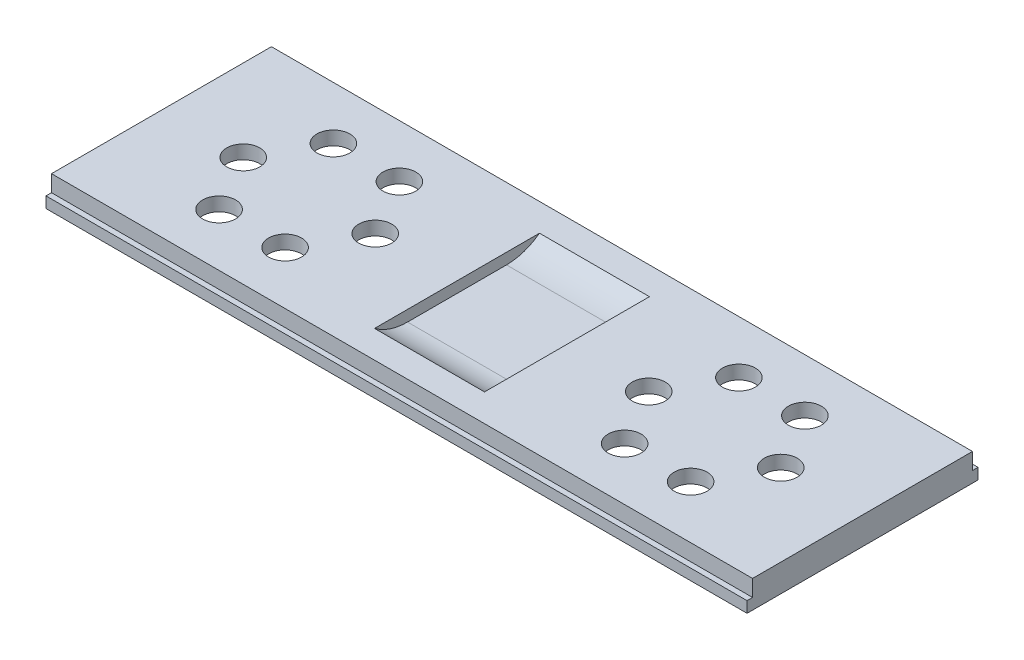
ISO-10303-21;
HEADER;
FILE_DESCRIPTION(('STEP AP214'),'2;1');
FILE_NAME('part.step','',(''),(''),'','','');
FILE_SCHEMA(('AUTOMOTIVE_DESIGN { 1 0 10303 214 1 1 1 1 }'));
ENDSEC;
DATA;
#1=APPLICATION_CONTEXT('core data for automotive mechanical design processes');
#2=APPLICATION_PROTOCOL_DEFINITION('international standard','automotive_design',2000,#1);
#3=PRODUCT_CONTEXT('',#1,'mechanical');
#4=PRODUCT('Part','Part','',(#3));
#5=PRODUCT_RELATED_PRODUCT_CATEGORY('part','',(#4));
#6=PRODUCT_DEFINITION_FORMATION('','',#4);
#7=PRODUCT_DEFINITION_CONTEXT('part definition',#1,'design');
#8=PRODUCT_DEFINITION('design','',#6,#7);
#9=PRODUCT_DEFINITION_SHAPE('','',#8);
#10=(LENGTH_UNIT() NAMED_UNIT(*) SI_UNIT(.MILLI.,.METRE.));
#11=(NAMED_UNIT(*) PLANE_ANGLE_UNIT() SI_UNIT($,.RADIAN.));
#12=(NAMED_UNIT(*) SI_UNIT($,.STERADIAN.) SOLID_ANGLE_UNIT());
#13=UNCERTAINTY_MEASURE_WITH_UNIT(LENGTH_MEASURE(1.E-05),#10,'distance_accuracy_value','');
#14=(GEOMETRIC_REPRESENTATION_CONTEXT(3) GLOBAL_UNCERTAINTY_ASSIGNED_CONTEXT((#13)) GLOBAL_UNIT_ASSIGNED_CONTEXT((#10,
#11,#12)) REPRESENTATION_CONTEXT('',''));
#15=CARTESIAN_POINT('',(0.,0.,0.));
#16=DIRECTION('',(0.,0.,1.));
#17=DIRECTION('',(1.,0.,0.));
#18=AXIS2_PLACEMENT_3D('',#15,#16,#17);
#19=CARTESIAN_POINT('',(-51.2673238301791,5.,23.60614063367));
#20=DIRECTION('',(0.,0.,-1.));
#21=DIRECTION('',(-1.,0.,0.));
#22=AXIS2_PLACEMENT_3D('',#19,#20,#21);
#23=PLANE('',#22);
#24=DIRECTION('',(1.,0.,0.));
#25=VECTOR('',#24,1.);
#26=CARTESIAN_POINT('',(76.2326761698209,2.,23.60614063367));
#27=LINE('',#26,#25);
#28=CARTESIAN_POINT('',(-51.2673238301791,2.,23.60614063367));
#29=VERTEX_POINT('',#28);
#30=CARTESIAN_POINT('',(76.2326761698209,2.,23.60614063367));
#31=VERTEX_POINT('',#30);
#32=EDGE_CURVE('E284',#29,#31,#27,.T.);
#33=ORIENTED_EDGE('',*,*,#32,.F.);
#34=DIRECTION('',(0.,-1.,0.));
#35=VECTOR('',#34,1.);
#36=CARTESIAN_POINT('',(-51.2673238301791,5.,23.60614063367));
#37=LINE('',#36,#35);
#38=CARTESIAN_POINT('',(-51.2673238301791,0.,23.60614063367));
#39=VERTEX_POINT('',#38);
#40=EDGE_CURVE('E314',#29,#39,#37,.T.);
#41=ORIENTED_EDGE('',*,*,#40,.T.);
#42=DIRECTION('',(1.,0.,0.));
#43=VECTOR('',#42,1.);
#44=CARTESIAN_POINT('',(-51.2673238301791,0.,23.60614063367));
#45=LINE('',#44,#43);
#46=CARTESIAN_POINT('',(76.2326761698209,0.,23.60614063367));
#47=VERTEX_POINT('',#46);
#48=EDGE_CURVE('E301',#39,#47,#45,.T.);
#49=ORIENTED_EDGE('',*,*,#48,.T.);
#50=DIRECTION('',(0.,-1.,0.));
#51=VECTOR('',#50,1.);
#52=CARTESIAN_POINT('',(76.2326761698209,5.,23.60614063367));
#53=LINE('',#52,#51);
#54=EDGE_CURVE('E312',#31,#47,#53,.T.);
#55=ORIENTED_EDGE('',*,*,#54,.F.);
#56=EDGE_LOOP('',(#33,#41,#49,#55));
#57=FACE_BOUND('',#56,.T.);
#58=ADVANCED_FACE('F34',(#57),#23,.F.);
#59=CARTESIAN_POINT('',(-51.2673238301791,5.,-18.39385936633));
#60=DIRECTION('',(1.,0.,0.));
#61=DIRECTION('',(0.,0.,-1.));
#62=AXIS2_PLACEMENT_3D('',#59,#60,#61);
#63=PLANE('',#62);
#64=DIRECTION('',(0.,0.,1.));
#65=VECTOR('',#64,1.);
#66=CARTESIAN_POINT('',(-51.2673238301791,5.,-18.39385936633));
#67=LINE('',#66,#65);
#68=CARTESIAN_POINT('',(-51.2673238301791,5.,-17.3938593663299));
#69=VERTEX_POINT('',#68);
#70=CARTESIAN_POINT('',(-51.2673238301791,5.,22.6061406336701));
#71=VERTEX_POINT('',#70);
#72=EDGE_CURVE('E291',#69,#71,#67,.T.);
#73=ORIENTED_EDGE('',*,*,#72,.F.);
#74=DIRECTION('',(0.,1.,0.));
#75=VECTOR('',#74,1.);
#76=CARTESIAN_POINT('',(-51.2673238301791,2.,-17.3938593663299));
#77=LINE('',#76,#75);
#78=CARTESIAN_POINT('',(-51.2673238301791,2.,-17.3938593663299));
#79=VERTEX_POINT('',#78);
#80=EDGE_CURVE('E268',#79,#69,#77,.T.);
#81=ORIENTED_EDGE('',*,*,#80,.F.);
#82=DIRECTION('',(0.,0.,1.));
#83=VECTOR('',#82,1.);
#84=CARTESIAN_POINT('',(-51.2673238301791,2.,-18.39385936633));
#85=LINE('',#84,#83);
#86=CARTESIAN_POINT('',(-51.2673238301791,2.,-18.39385936633));
#87=VERTEX_POINT('',#86);
#88=EDGE_CURVE('E263',#87,#79,#85,.T.);
#89=ORIENTED_EDGE('',*,*,#88,.F.);
#90=DIRECTION('',(0.,-1.,0.));
#91=VECTOR('',#90,1.);
#92=CARTESIAN_POINT('',(-51.2673238301791,5.,-18.39385936633));
#93=LINE('',#92,#91);
#94=CARTESIAN_POINT('',(-51.2673238301791,0.,-18.39385936633));
#95=VERTEX_POINT('',#94);
#96=EDGE_CURVE('E298',#87,#95,#93,.T.);
#97=ORIENTED_EDGE('',*,*,#96,.T.);
#98=DIRECTION('',(0.,0.,1.));
#99=VECTOR('',#98,1.);
#100=CARTESIAN_POINT('',(-51.2673238301791,0.,-18.39385936633));
#101=LINE('',#100,#99);
#102=EDGE_CURVE('E274',#95,#39,#101,.T.);
#103=ORIENTED_EDGE('',*,*,#102,.T.);
#104=ORIENTED_EDGE('',*,*,#40,.F.);
#105=DIRECTION('',(0.,0.,1.));
#106=VECTOR('',#105,1.);
#107=CARTESIAN_POINT('',(-51.2673238301791,2.,23.60614063367));
#108=LINE('',#107,#106);
#109=CARTESIAN_POINT('',(-51.2673238301791,2.,22.6061406336701));
#110=VERTEX_POINT('',#109);
#111=EDGE_CURVE('E282',#110,#29,#108,.T.);
#112=ORIENTED_EDGE('',*,*,#111,.F.);
#113=DIRECTION('',(0.,1.,0.));
#114=VECTOR('',#113,1.);
#115=CARTESIAN_POINT('',(-51.2673238301791,2.,22.6061406336701));
#116=LINE('',#115,#114);
#117=EDGE_CURVE('E270',#110,#71,#116,.T.);
#118=ORIENTED_EDGE('',*,*,#117,.T.);
#119=EDGE_LOOP('',(#73,#81,#89,#97,#103,#104,#112,#118));
#120=FACE_BOUND('',#119,.T.);
#121=ADVANCED_FACE('F354',(#120),#63,.F.);
#122=CARTESIAN_POINT('',(76.2326761698209,5.,-18.39385936633));
#123=DIRECTION('',(-1.,0.,0.));
#124=DIRECTION('',(0.,0.,1.));
#125=AXIS2_PLACEMENT_3D('',#122,#123,#124);
#126=PLANE('',#125);
#127=DIRECTION('',(0.,0.,-1.));
#128=VECTOR('',#127,1.);
#129=CARTESIAN_POINT('',(76.2326761698209,2.,-18.39385936633));
#130=LINE('',#129,#128);
#131=CARTESIAN_POINT('',(76.2326761698209,2.,-17.39385936633));
#132=VERTEX_POINT('',#131);
#133=CARTESIAN_POINT('',(76.2326761698209,2.,-18.39385936633));
#134=VERTEX_POINT('',#133);
#135=EDGE_CURVE('E258',#132,#134,#130,.T.);
#136=ORIENTED_EDGE('',*,*,#135,.F.);
#137=DIRECTION('',(0.,1.,0.));
#138=VECTOR('',#137,1.);
#139=CARTESIAN_POINT('',(76.2326761698209,2.,-17.39385936633));
#140=LINE('',#139,#138);
#141=CARTESIAN_POINT('',(76.2326761698209,5.,-17.39385936633));
#142=VERTEX_POINT('',#141);
#143=EDGE_CURVE('E271',#132,#142,#140,.T.);
#144=ORIENTED_EDGE('',*,*,#143,.T.);
#145=DIRECTION('',(0.,0.,-1.));
#146=VECTOR('',#145,1.);
#147=CARTESIAN_POINT('',(76.2326761698209,5.,-18.39385936633));
#148=LINE('',#147,#146);
#149=CARTESIAN_POINT('',(76.2326761698209,5.,22.60614063367));
#150=VERTEX_POINT('',#149);
#151=EDGE_CURVE('E294',#150,#142,#148,.T.);
#152=ORIENTED_EDGE('',*,*,#151,.F.);
#153=DIRECTION('',(0.,1.,0.));
#154=VECTOR('',#153,1.);
#155=CARTESIAN_POINT('',(76.2326761698209,2.,22.60614063367));
#156=LINE('',#155,#154);
#157=CARTESIAN_POINT('',(76.2326761698209,2.,22.60614063367));
#158=VERTEX_POINT('',#157);
#159=EDGE_CURVE('E286',#158,#150,#156,.T.);
#160=ORIENTED_EDGE('',*,*,#159,.F.);
#161=DIRECTION('',(0.,0.,-1.));
#162=VECTOR('',#161,1.);
#163=CARTESIAN_POINT('',(76.2326761698209,2.,23.60614063367));
#164=LINE('',#163,#162);
#165=EDGE_CURVE('E276',#31,#158,#164,.T.);
#166=ORIENTED_EDGE('',*,*,#165,.F.);
#167=ORIENTED_EDGE('',*,*,#54,.T.);
#168=DIRECTION('',(0.,0.,-1.));
#169=VECTOR('',#168,1.);
#170=CARTESIAN_POINT('',(76.2326761698209,0.,-18.39385936633));
#171=LINE('',#170,#169);
#172=CARTESIAN_POINT('',(76.2326761698209,0.,-18.39385936633));
#173=VERTEX_POINT('',#172);
#174=EDGE_CURVE('E304',#47,#173,#171,.T.);
#175=ORIENTED_EDGE('',*,*,#174,.T.);
#176=DIRECTION('',(0.,-1.,0.));
#177=VECTOR('',#176,1.);
#178=CARTESIAN_POINT('',(76.2326761698209,5.,-18.39385936633));
#179=LINE('',#178,#177);
#180=EDGE_CURVE('E310',#134,#173,#179,.T.);
#181=ORIENTED_EDGE('',*,*,#180,.F.);
#182=EDGE_LOOP('',(#136,#144,#152,#160,#166,#167,#175,#181));
#183=FACE_BOUND('',#182,.T.);
#184=ADVANCED_FACE('F360',(#183),#126,.F.);
#185=CARTESIAN_POINT('',(-51.2673238301791,5.,-18.39385936633));
#186=DIRECTION('',(0.,0.,1.));
#187=DIRECTION('',(1.,0.,0.));
#188=AXIS2_PLACEMENT_3D('',#185,#186,#187);
#189=PLANE('',#188);
#190=ORIENTED_EDGE('',*,*,#96,.F.);
#191=DIRECTION('',(-1.,0.,0.));
#192=VECTOR('',#191,1.);
#193=CARTESIAN_POINT('',(76.2326761698209,2.,-18.39385936633));
#194=LINE('',#193,#192);
#195=EDGE_CURVE('E260',#134,#87,#194,.T.);
#196=ORIENTED_EDGE('',*,*,#195,.F.);
#197=ORIENTED_EDGE('',*,*,#180,.T.);
#198=DIRECTION('',(-1.,0.,0.));
#199=VECTOR('',#198,1.);
#200=CARTESIAN_POINT('',(-51.2673238301791,0.,-18.39385936633));
#201=LINE('',#200,#199);
#202=EDGE_CURVE('E295',#173,#95,#201,.T.);
#203=ORIENTED_EDGE('',*,*,#202,.T.);
#204=EDGE_LOOP('',(#190,#196,#197,#203));
#205=FACE_BOUND('',#204,.T.);
#206=ADVANCED_FACE('F366',(#205),#189,.F.);
#207=CARTESIAN_POINT('',(0.,5.,0.));
#208=DIRECTION('',(0.,1.,0.));
#209=DIRECTION('',(0.,0.,1.));
#210=AXIS2_PLACEMENT_3D('',#207,#208,#209);
#211=PLANE('',#210);
#212=CARTESIAN_POINT('',(43.3576761698208,5.,12.9984454790833));
#213=DIRECTION('',(0.,1.,0.));
#214=DIRECTION('',(0.,0.,1.));
#215=AXIS2_PLACEMENT_3D('',#212,#213,#214);
#216=CIRCLE('',#215,3.00000000000001);
#217=CARTESIAN_POINT('',(43.3576761698208,5.,15.9984454790833));
#218=VERTEX_POINT('',#217);
#219=EDGE_CURVE('E481',#218,#218,#216,.T.);
#220=ORIENTED_EDGE('',*,*,#219,.F.);
#221=EDGE_LOOP('',(#220));
#222=FACE_BOUND('',#221,.T.);
#223=CARTESIAN_POINT('',(55.3576761698209,5.,12.9984454790833));
#224=DIRECTION('',(0.,1.,0.));
#225=DIRECTION('',(0.,0.,1.));
#226=AXIS2_PLACEMENT_3D('',#223,#224,#225);
#227=CIRCLE('',#226,3.00000000000001);
#228=CARTESIAN_POINT('',(55.3576761698209,5.,15.9984454790833));
#229=VERTEX_POINT('',#228);
#230=EDGE_CURVE('E511',#229,#229,#227,.T.);
#231=ORIENTED_EDGE('',*,*,#230,.F.);
#232=EDGE_LOOP('',(#231));
#233=FACE_BOUND('',#232,.T.);
#234=CARTESIAN_POINT('',(-18.392323830179,5.,-7.78616421174316));
#235=DIRECTION('',(0.,1.,0.));
#236=DIRECTION('',(0.,0.,1.));
#237=AXIS2_PLACEMENT_3D('',#234,#235,#236);
#238=CIRCLE('',#237,3.);
#239=CARTESIAN_POINT('',(-18.392323830179,5.,-4.78616421174316));
#240=VERTEX_POINT('',#239);
#241=EDGE_CURVE('E505',#240,#240,#238,.T.);
#242=ORIENTED_EDGE('',*,*,#241,.F.);
#243=EDGE_LOOP('',(#242));
#244=FACE_BOUND('',#243,.T.);
#245=CARTESIAN_POINT('',(-30.392323830179,5.,-7.78616421174328));
#246=DIRECTION('',(0.,1.,0.));
#247=DIRECTION('',(0.,0.,1.));
#248=AXIS2_PLACEMENT_3D('',#245,#246,#247);
#249=CIRCLE('',#248,3.);
#250=CARTESIAN_POINT('',(-30.392323830179,5.,-4.78616421174328));
#251=VERTEX_POINT('',#250);
#252=EDGE_CURVE('E499',#251,#251,#249,.T.);
#253=ORIENTED_EDGE('',*,*,#252,.F.);
#254=EDGE_LOOP('',(#253));
#255=FACE_BOUND('',#254,.T.);
#256=CARTESIAN_POINT('',(-36.3923238301791,5.,2.60614063366996));
#257=DIRECTION('',(0.,1.,0.));
#258=DIRECTION('',(0.,0.,1.));
#259=AXIS2_PLACEMENT_3D('',#256,#257,#258);
#260=CIRCLE('',#259,3.);
#261=CARTESIAN_POINT('',(-36.3923238301791,5.,5.60614063366996));
#262=VERTEX_POINT('',#261);
#263=EDGE_CURVE('E498',#262,#262,#260,.T.);
#264=ORIENTED_EDGE('',*,*,#263,.F.);
#265=EDGE_LOOP('',(#264));
#266=FACE_BOUND('',#265,.T.);
#267=CARTESIAN_POINT('',(-30.3923238301792,5.,12.9984454790833));
#268=DIRECTION('',(0.,1.,0.));
#269=DIRECTION('',(0.,0.,1.));
#270=AXIS2_PLACEMENT_3D('',#267,#268,#269);
#271=CIRCLE('',#270,3.);
#272=CARTESIAN_POINT('',(-30.3923238301792,5.,15.9984454790833));
#273=VERTEX_POINT('',#272);
#274=EDGE_CURVE('E534',#273,#273,#271,.T.);
#275=ORIENTED_EDGE('',*,*,#274,.F.);
#276=EDGE_LOOP('',(#275));
#277=FACE_BOUND('',#276,.T.);
#278=CARTESIAN_POINT('',(-18.3923238301791,5.,12.9984454790833));
#279=DIRECTION('',(0.,1.,0.));
#280=DIRECTION('',(0.,0.,1.));
#281=AXIS2_PLACEMENT_3D('',#278,#279,#280);
#282=CIRCLE('',#281,3.);
#283=CARTESIAN_POINT('',(-18.3923238301791,5.,15.9984454790833));
#284=VERTEX_POINT('',#283);
#285=EDGE_CURVE('E528',#284,#284,#282,.T.);
#286=ORIENTED_EDGE('',*,*,#285,.F.);
#287=EDGE_LOOP('',(#286));
#288=FACE_BOUND('',#287,.T.);
#289=CARTESIAN_POINT('',(61.3576761698209,5.,2.60614063367005));
#290=DIRECTION('',(0.,1.,0.));
#291=DIRECTION('',(0.,0.,1.));
#292=AXIS2_PLACEMENT_3D('',#289,#290,#291);
#293=CIRCLE('',#292,3.00000000000001);
#294=CARTESIAN_POINT('',(61.3576761698209,5.,5.60614063367005));
#295=VERTEX_POINT('',#294);
#296=EDGE_CURVE('E522',#295,#295,#293,.T.);
#297=ORIENTED_EDGE('',*,*,#296,.F.);
#298=EDGE_LOOP('',(#297));
#299=FACE_BOUND('',#298,.T.);
#300=CARTESIAN_POINT('',(37.3576761698209,5.,2.60614063366996));
#301=DIRECTION('',(0.,1.,0.));
#302=DIRECTION('',(0.,0.,1.));
#303=AXIS2_PLACEMENT_3D('',#300,#301,#302);
#304=CIRCLE('',#303,3.00000000000001);
#305=CARTESIAN_POINT('',(37.3576761698209,5.,5.60614063366997));
#306=VERTEX_POINT('',#305);
#307=EDGE_CURVE('E477',#306,#306,#304,.T.);
#308=ORIENTED_EDGE('',*,*,#307,.F.);
#309=EDGE_LOOP('',(#308));
#310=FACE_BOUND('',#309,.T.);
#311=CARTESIAN_POINT('',(43.357676169821,5.,-7.78616421174326));
#312=DIRECTION('',(0.,1.,0.));
#313=DIRECTION('',(0.,0.,1.));
#314=AXIS2_PLACEMENT_3D('',#311,#312,#313);
#315=CIRCLE('',#314,3.00000000000001);
#316=CARTESIAN_POINT('',(43.357676169821,5.,-4.78616421174325));
#317=VERTEX_POINT('',#316);
#318=EDGE_CURVE('E484',#317,#317,#315,.T.);
#319=ORIENTED_EDGE('',*,*,#318,.F.);
#320=EDGE_LOOP('',(#319));
#321=FACE_BOUND('',#320,.T.);
#322=CARTESIAN_POINT('',(55.357676169821,5.,-7.78616421174314));
#323=DIRECTION('',(0.,1.,0.));
#324=DIRECTION('',(0.,0.,1.));
#325=AXIS2_PLACEMENT_3D('',#322,#323,#324);
#326=CIRCLE('',#325,3.00000000000001);
#327=CARTESIAN_POINT('',(55.357676169821,5.,-4.78616421174313));
#328=VERTEX_POINT('',#327);
#329=EDGE_CURVE('E492',#328,#328,#326,.T.);
#330=ORIENTED_EDGE('',*,*,#329,.F.);
#331=EDGE_LOOP('',(#330));
#332=FACE_BOUND('',#331,.T.);
#333=CARTESIAN_POINT('',(-12.3923238301791,5.,2.60614063367005));
#334=DIRECTION('',(0.,1.,0.));
#335=DIRECTION('',(0.,0.,1.));
#336=AXIS2_PLACEMENT_3D('',#333,#334,#335);
#337=CIRCLE('',#336,3.);
#338=CARTESIAN_POINT('',(-12.3923238301791,5.,5.60614063367005));
#339=VERTEX_POINT('',#338);
#340=EDGE_CURVE('E206',#339,#339,#337,.T.);
#341=ORIENTED_EDGE('',*,*,#340,.F.);
#342=EDGE_LOOP('',(#341));
#343=FACE_BOUND('',#342,.T.);
#344=DIRECTION('',(0.,0.,-1.));
#345=VECTOR('',#344,1.);
#346=CARTESIAN_POINT('',(22.4826761698209,5.,-12.39385936633));
#347=LINE('',#346,#345);
#348=CARTESIAN_POINT('',(22.4826761698209,5.,17.60614063367));
#349=VERTEX_POINT('',#348);
#350=CARTESIAN_POINT('',(22.4826761698209,5.,-12.39385936633));
#351=VERTEX_POINT('',#350);
#352=EDGE_CURVE('E244',#349,#351,#347,.T.);
#353=ORIENTED_EDGE('',*,*,#352,.F.);
#354=DIRECTION('',(1.,0.,0.));
#355=VECTOR('',#354,1.);
#356=CARTESIAN_POINT('',(2.48267616982091,5.,17.60614063367));
#357=LINE('',#356,#355);
#358=CARTESIAN_POINT('',(2.48267616982091,5.,17.60614063367));
#359=VERTEX_POINT('',#358);
#360=EDGE_CURVE('E248',#359,#349,#357,.T.);
#361=ORIENTED_EDGE('',*,*,#360,.F.);
#362=DIRECTION('',(0.,0.,1.));
#363=VECTOR('',#362,1.);
#364=CARTESIAN_POINT('',(2.4826761698209,5.,-12.39385936633));
#365=LINE('',#364,#363);
#366=CARTESIAN_POINT('',(2.4826761698209,5.,-12.39385936633));
#367=VERTEX_POINT('',#366);
#368=EDGE_CURVE('E254',#367,#359,#365,.T.);
#369=ORIENTED_EDGE('',*,*,#368,.F.);
#370=DIRECTION('',(-1.,0.,0.));
#371=VECTOR('',#370,1.);
#372=CARTESIAN_POINT('',(2.4826761698209,5.,-12.39385936633));
#373=LINE('',#372,#371);
#374=EDGE_CURVE('E252',#351,#367,#373,.T.);
#375=ORIENTED_EDGE('',*,*,#374,.F.);
#376=EDGE_LOOP('',(#353,#361,#369,#375));
#377=FACE_BOUND('',#376,.T.);
#378=DIRECTION('',(1.,0.,0.));
#379=VECTOR('',#378,1.);
#380=CARTESIAN_POINT('',(76.2326761698209,5.,-17.39385936633));
#381=LINE('',#380,#379);
#382=EDGE_CURVE('E261',#69,#142,#381,.T.);
#383=ORIENTED_EDGE('',*,*,#382,.F.);
#384=ORIENTED_EDGE('',*,*,#72,.T.);
#385=DIRECTION('',(-1.,0.,0.));
#386=VECTOR('',#385,1.);
#387=CARTESIAN_POINT('',(76.2326761698209,5.,22.60614063367));
#388=LINE('',#387,#386);
#389=EDGE_CURVE('E250',#150,#71,#388,.T.);
#390=ORIENTED_EDGE('',*,*,#389,.F.);
#391=ORIENTED_EDGE('',*,*,#151,.T.);
#392=EDGE_LOOP('',(#383,#384,#390,#391));
#393=FACE_BOUND('',#392,.T.);
#394=ADVANCED_FACE('F333',(#222,#233,#244,#255,#266,#277,#288,#299,#310,#321,#332,#343,#377,
#393),#211,.T.);
#395=CARTESIAN_POINT('',(0.,0.,0.));
#396=DIRECTION('',(0.,1.,0.));
#397=DIRECTION('',(0.,0.,1.));
#398=AXIS2_PLACEMENT_3D('',#395,#396,#397);
#399=PLANE('',#398);
#400=DIRECTION('',(-1.,0.,0.));
#401=VECTOR('',#400,1.);
#402=CARTESIAN_POINT('',(0.,0.,20.1061406336701));
#403=LINE('',#402,#401);
#404=CARTESIAN_POINT('',(73.7326761698209,0.,20.10614063367));
#405=VERTEX_POINT('',#404);
#406=CARTESIAN_POINT('',(-48.7673238301791,0.,20.1061406336701));
#407=VERTEX_POINT('',#406);
#408=EDGE_CURVE('E242',#405,#407,#403,.T.);
#409=ORIENTED_EDGE('',*,*,#408,.F.);
#410=DIRECTION('',(0.,0.,-1.));
#411=VECTOR('',#410,1.);
#412=CARTESIAN_POINT('',(73.7326761698209,0.,-18.39385936633));
#413=LINE('',#412,#411);
#414=CARTESIAN_POINT('',(73.7326761698209,0.,-14.89385936633));
#415=VERTEX_POINT('',#414);
#416=EDGE_CURVE('E198',#405,#415,#413,.T.);
#417=ORIENTED_EDGE('',*,*,#416,.T.);
#418=DIRECTION('',(-1.,0.,0.));
#419=VECTOR('',#418,1.);
#420=CARTESIAN_POINT('',(76.2326761698209,0.,-14.89385936633));
#421=LINE('',#420,#419);
#422=CARTESIAN_POINT('',(-48.7673238301791,0.,-14.8938593663299));
#423=VERTEX_POINT('',#422);
#424=EDGE_CURVE('E201',#415,#423,#421,.T.);
#425=ORIENTED_EDGE('',*,*,#424,.T.);
#426=DIRECTION('',(0.,0.,1.));
#427=VECTOR('',#426,1.);
#428=CARTESIAN_POINT('',(-48.7673238301791,0.,-18.39385936633));
#429=LINE('',#428,#427);
#430=EDGE_CURVE('E189',#423,#407,#429,.T.);
#431=ORIENTED_EDGE('',*,*,#430,.T.);
#432=EDGE_LOOP('',(#409,#417,#425,#431));
#433=FACE_BOUND('',#432,.T.);
#434=ORIENTED_EDGE('',*,*,#102,.F.);
#435=ORIENTED_EDGE('',*,*,#202,.F.);
#436=ORIENTED_EDGE('',*,*,#174,.F.);
#437=ORIENTED_EDGE('',*,*,#48,.F.);
#438=EDGE_LOOP('',(#434,#435,#436,#437));
#439=FACE_BOUND('',#438,.T.);
#440=ADVANCED_FACE('F371',(#433,#439),#399,.F.);
#441=CARTESIAN_POINT('',(76.2326761698209,2.,22.60614063367));
#442=DIRECTION('',(0.,0.,-1.));
#443=DIRECTION('',(-1.,0.,0.));
#444=AXIS2_PLACEMENT_3D('',#441,#442,#443);
#445=PLANE('',#444);
#446=ORIENTED_EDGE('',*,*,#389,.T.);
#447=ORIENTED_EDGE('',*,*,#117,.F.);
#448=DIRECTION('',(-1.,0.,0.));
#449=VECTOR('',#448,1.);
#450=CARTESIAN_POINT('',(76.2326761698209,2.,22.60614063367));
#451=LINE('',#450,#449);
#452=EDGE_CURVE('E279',#158,#110,#451,.T.);
#453=ORIENTED_EDGE('',*,*,#452,.F.);
#454=ORIENTED_EDGE('',*,*,#159,.T.);
#455=EDGE_LOOP('',(#446,#447,#453,#454));
#456=FACE_BOUND('',#455,.T.);
#457=ADVANCED_FACE('F374',(#456),#445,.F.);
#458=CARTESIAN_POINT('',(0.,2.,0.));
#459=DIRECTION('',(0.,1.,0.));
#460=DIRECTION('',(0.,0.,1.));
#461=AXIS2_PLACEMENT_3D('',#458,#459,#460);
#462=PLANE('',#461);
#463=ORIENTED_EDGE('',*,*,#165,.T.);
#464=ORIENTED_EDGE('',*,*,#452,.T.);
#465=ORIENTED_EDGE('',*,*,#111,.T.);
#466=ORIENTED_EDGE('',*,*,#32,.T.);
#467=EDGE_LOOP('',(#463,#464,#465,#466));
#468=FACE_BOUND('',#467,.T.);
#469=ADVANCED_FACE('F381',(#468),#462,.T.);
#470=CARTESIAN_POINT('',(76.2326761698209,2.,-17.39385936633));
#471=DIRECTION('',(0.,0.,1.));
#472=DIRECTION('',(1.,0.,0.));
#473=AXIS2_PLACEMENT_3D('',#470,#471,#472);
#474=PLANE('',#473);
#475=ORIENTED_EDGE('',*,*,#382,.T.);
#476=ORIENTED_EDGE('',*,*,#143,.F.);
#477=DIRECTION('',(1.,0.,0.));
#478=VECTOR('',#477,1.);
#479=CARTESIAN_POINT('',(76.2326761698209,2.,-17.39385936633));
#480=LINE('',#479,#478);
#481=EDGE_CURVE('E265',#79,#132,#480,.T.);
#482=ORIENTED_EDGE('',*,*,#481,.F.);
#483=ORIENTED_EDGE('',*,*,#80,.T.);
#484=EDGE_LOOP('',(#475,#476,#482,#483));
#485=FACE_BOUND('',#484,.T.);
#486=ADVANCED_FACE('F385',(#485),#474,.F.);
#487=CARTESIAN_POINT('',(0.,2.,0.));
#488=DIRECTION('',(0.,-1.,0.));
#489=DIRECTION('',(0.,0.,-1.));
#490=AXIS2_PLACEMENT_3D('',#487,#488,#489);
#491=PLANE('',#490);
#492=ORIENTED_EDGE('',*,*,#135,.T.);
#493=ORIENTED_EDGE('',*,*,#195,.T.);
#494=ORIENTED_EDGE('',*,*,#88,.T.);
#495=ORIENTED_EDGE('',*,*,#481,.T.);
#496=EDGE_LOOP('',(#492,#493,#494,#495));
#497=FACE_BOUND('',#496,.T.);
#498=ADVANCED_FACE('F389',(#497),#491,.F.);
#499=CARTESIAN_POINT('',(22.4826761698209,3.,-12.39385936633));
#500=DIRECTION('',(1.,0.,0.));
#501=DIRECTION('',(0.,0.,-1.));
#502=AXIS2_PLACEMENT_3D('',#499,#500,#501);
#503=PLANE('',#502);
#504=ORIENTED_EDGE('',*,*,#352,.T.);
#505=CARTESIAN_POINT('',(22.4826761698209,13.,-6.39385936632995));
#506=DIRECTION('',(1.,0.,0.));
#507=DIRECTION('',(0.,0.,-1.));
#508=AXIS2_PLACEMENT_3D('',#505,#506,#507);
#509=CIRCLE('',#508,10.);
#510=CARTESIAN_POINT('',(22.4826761698209,3.,-6.39385936632995));
#511=VERTEX_POINT('',#510);
#512=EDGE_CURVE('E11',#351,#511,#509,.F.);
#513=ORIENTED_EDGE('',*,*,#512,.T.);
#514=DIRECTION('',(0.,0.,-1.));
#515=VECTOR('',#514,1.);
#516=CARTESIAN_POINT('',(22.4826761698209,3.,-12.39385936633));
#517=LINE('',#516,#515);
#518=CARTESIAN_POINT('',(22.4826761698209,3.,11.60614063367));
#519=VERTEX_POINT('',#518);
#520=EDGE_CURVE('E245',#519,#511,#517,.T.);
#521=ORIENTED_EDGE('',*,*,#520,.F.);
#522=CARTESIAN_POINT('',(22.4826761698209,13.,11.60614063367));
#523=DIRECTION('',(1.,0.,0.));
#524=DIRECTION('',(0.,0.,-1.));
#525=AXIS2_PLACEMENT_3D('',#522,#523,#524);
#526=CIRCLE('',#525,10.);
#527=EDGE_CURVE('E319',#519,#349,#526,.F.);
#528=ORIENTED_EDGE('',*,*,#527,.T.);
#529=EDGE_LOOP('',(#504,#513,#521,#528));
#530=FACE_BOUND('',#529,.T.);
#531=ADVANCED_FACE('F339',(#530),#503,.F.);
#532=CARTESIAN_POINT('',(2.4826761698209,3.,-12.39385936633));
#533=DIRECTION('',(-1.,0.,0.));
#534=DIRECTION('',(0.,0.,1.));
#535=AXIS2_PLACEMENT_3D('',#532,#533,#534);
#536=PLANE('',#535);
#537=DIRECTION('',(0.,0.,1.));
#538=VECTOR('',#537,1.);
#539=CARTESIAN_POINT('',(2.4826761698209,3.,-12.39385936633));
#540=LINE('',#539,#538);
#541=CARTESIAN_POINT('',(2.4826761698209,3.,-6.39385936632995));
#542=VERTEX_POINT('',#541);
#543=CARTESIAN_POINT('',(2.48267616982091,3.,11.60614063367));
#544=VERTEX_POINT('',#543);
#545=EDGE_CURVE('E247',#542,#544,#540,.T.);
#546=ORIENTED_EDGE('',*,*,#545,.F.);
#547=CARTESIAN_POINT('',(2.4826761698209,13.,-6.39385936632995));
#548=DIRECTION('',(-1.,0.,0.));
#549=DIRECTION('',(0.,0.,1.));
#550=AXIS2_PLACEMENT_3D('',#547,#548,#549);
#551=CIRCLE('',#550,10.);
#552=EDGE_CURVE('E42',#542,#367,#551,.F.);
#553=ORIENTED_EDGE('',*,*,#552,.T.);
#554=ORIENTED_EDGE('',*,*,#368,.T.);
#555=CARTESIAN_POINT('',(2.48267616982091,13.,11.60614063367));
#556=DIRECTION('',(-1.,0.,0.));
#557=DIRECTION('',(0.,0.,1.));
#558=AXIS2_PLACEMENT_3D('',#555,#556,#557);
#559=CIRCLE('',#558,10.);
#560=EDGE_CURVE('E321',#359,#544,#559,.F.);
#561=ORIENTED_EDGE('',*,*,#560,.T.);
#562=EDGE_LOOP('',(#546,#553,#554,#561));
#563=FACE_BOUND('',#562,.T.);
#564=ADVANCED_FACE('F328',(#563),#536,.F.);
#565=CARTESIAN_POINT('',(0.,3.,0.));
#566=DIRECTION('',(0.,1.,0.));
#567=DIRECTION('',(0.,0.,1.));
#568=AXIS2_PLACEMENT_3D('',#565,#566,#567);
#569=PLANE('',#568);
#570=ORIENTED_EDGE('',*,*,#520,.T.);
#571=DIRECTION('',(-1.,0.,0.));
#572=VECTOR('',#571,1.);
#573=CARTESIAN_POINT('',(2.4826761698209,3.,-6.39385936632995));
#574=LINE('',#573,#572);
#575=EDGE_CURVE('E324',#511,#542,#574,.T.);
#576=ORIENTED_EDGE('',*,*,#575,.T.);
#577=ORIENTED_EDGE('',*,*,#545,.T.);
#578=DIRECTION('',(1.,0.,0.));
#579=VECTOR('',#578,1.);
#580=CARTESIAN_POINT('',(22.4826761698209,3.,11.60614063367));
#581=LINE('',#580,#579);
#582=EDGE_CURVE('E316',#544,#519,#581,.T.);
#583=ORIENTED_EDGE('',*,*,#582,.T.);
#584=EDGE_LOOP('',(#570,#576,#577,#583));
#585=FACE_BOUND('',#584,.T.);
#586=ADVANCED_FACE('F337',(#585),#569,.T.);
#587=CARTESIAN_POINT('',(76.2326761698209,2.,-14.89385936633));
#588=DIRECTION('',(0.,0.,1.));
#589=DIRECTION('',(1.,0.,0.));
#590=AXIS2_PLACEMENT_3D('',#587,#588,#589);
#591=PLANE('',#590);
#592=DIRECTION('',(0.,1.,0.));
#593=VECTOR('',#592,1.);
#594=CARTESIAN_POINT('',(24.9826761698209,3.,-14.89385936633));
#595=LINE('',#594,#593);
#596=CARTESIAN_POINT('',(24.9826761698209,0.5,-14.89385936633));
#597=VERTEX_POINT('',#596);
#598=CARTESIAN_POINT('',(24.9826761698209,2.5,-14.89385936633));
#599=VERTEX_POINT('',#598);
#600=EDGE_CURVE('E224',#597,#599,#595,.T.);
#601=ORIENTED_EDGE('',*,*,#600,.F.);
#602=DIRECTION('',(-1.,0.,0.));
#603=VECTOR('',#602,1.);
#604=CARTESIAN_POINT('',(0.,0.5,-14.89385936633));
#605=LINE('',#604,#603);
#606=CARTESIAN_POINT('',(-0.0173238301790973,0.5,-14.89385936633));
#607=VERTEX_POINT('',#606);
#608=EDGE_CURVE('E229',#597,#607,#605,.T.);
#609=ORIENTED_EDGE('',*,*,#608,.T.);
#610=DIRECTION('',(0.,1.,0.));
#611=VECTOR('',#610,1.);
#612=CARTESIAN_POINT('',(-0.0173238301790974,3.,-14.89385936633));
#613=LINE('',#612,#611);
#614=CARTESIAN_POINT('',(-0.0173238301790973,2.5,-14.8938593663299));
#615=VERTEX_POINT('',#614);
#616=EDGE_CURVE('E175',#607,#615,#613,.T.);
#617=ORIENTED_EDGE('',*,*,#616,.T.);
#618=DIRECTION('',(1.,0.,0.));
#619=VECTOR('',#618,1.);
#620=CARTESIAN_POINT('',(0.,2.5,-14.8938593663299));
#621=LINE('',#620,#619);
#622=CARTESIAN_POINT('',(-48.7673238301791,2.5,-14.8938593663299));
#623=VERTEX_POINT('',#622);
#624=EDGE_CURVE('E169',#623,#615,#621,.T.);
#625=ORIENTED_EDGE('',*,*,#624,.F.);
#626=DIRECTION('',(0.,1.,0.));
#627=VECTOR('',#626,1.);
#628=CARTESIAN_POINT('',(-48.7673238301791,2.,-14.8938593663299));
#629=LINE('',#628,#627);
#630=EDGE_CURVE('E172',#423,#623,#629,.T.);
#631=ORIENTED_EDGE('',*,*,#630,.F.);
#632=ORIENTED_EDGE('',*,*,#424,.F.);
#633=DIRECTION('',(0.,1.,0.));
#634=VECTOR('',#633,1.);
#635=CARTESIAN_POINT('',(73.7326761698209,5.,-14.89385936633));
#636=LINE('',#635,#634);
#637=CARTESIAN_POINT('',(73.7326761698209,2.5,-14.89385936633));
#638=VERTEX_POINT('',#637);
#639=EDGE_CURVE('E191',#415,#638,#636,.T.);
#640=ORIENTED_EDGE('',*,*,#639,.T.);
#641=EDGE_CURVE('E180',#599,#638,#621,.T.);
#642=ORIENTED_EDGE('',*,*,#641,.F.);
#643=EDGE_LOOP('',(#601,#609,#617,#625,#631,#632,#640,#642));
#644=FACE_BOUND('',#643,.T.);
#645=ADVANCED_FACE('F171',(#644),#591,.T.);
#646=CARTESIAN_POINT('',(76.2326761698209,2.,20.10614063367));
#647=DIRECTION('',(0.,0.,-1.));
#648=DIRECTION('',(-1.,0.,0.));
#649=AXIS2_PLACEMENT_3D('',#646,#647,#648);
#650=PLANE('',#649);
#651=DIRECTION('',(0.,1.,0.));
#652=VECTOR('',#651,1.);
#653=CARTESIAN_POINT('',(-0.0173238301790928,3.,20.10614063367));
#654=LINE('',#653,#652);
#655=CARTESIAN_POINT('',(-0.0173238301790928,0.5,20.10614063367));
#656=VERTEX_POINT('',#655);
#657=CARTESIAN_POINT('',(-0.0173238301790928,2.5,20.10614063367));
#658=VERTEX_POINT('',#657);
#659=EDGE_CURVE('E232',#656,#658,#654,.T.);
#660=ORIENTED_EDGE('',*,*,#659,.F.);
#661=DIRECTION('',(1.,0.,0.));
#662=VECTOR('',#661,1.);
#663=CARTESIAN_POINT('',(0.,0.5,20.10614063367));
#664=LINE('',#663,#662);
#665=CARTESIAN_POINT('',(24.9826761698209,0.5,20.10614063367));
#666=VERTEX_POINT('',#665);
#667=EDGE_CURVE('E226',#656,#666,#664,.T.);
#668=ORIENTED_EDGE('',*,*,#667,.T.);
#669=DIRECTION('',(0.,1.,0.));
#670=VECTOR('',#669,1.);
#671=CARTESIAN_POINT('',(24.9826761698209,3.,20.10614063367));
#672=LINE('',#671,#670);
#673=CARTESIAN_POINT('',(24.9826761698209,2.5,20.10614063367));
#674=VERTEX_POINT('',#673);
#675=EDGE_CURVE('E230',#666,#674,#672,.T.);
#676=ORIENTED_EDGE('',*,*,#675,.T.);
#677=DIRECTION('',(-1.,0.,0.));
#678=VECTOR('',#677,1.);
#679=CARTESIAN_POINT('',(0.,2.5,20.1061406336701));
#680=LINE('',#679,#678);
#681=CARTESIAN_POINT('',(73.7326761698209,2.5,20.10614063367));
#682=VERTEX_POINT('',#681);
#683=EDGE_CURVE('E223',#682,#674,#680,.T.);
#684=ORIENTED_EDGE('',*,*,#683,.F.);
#685=DIRECTION('',(0.,1.,0.));
#686=VECTOR('',#685,1.);
#687=CARTESIAN_POINT('',(73.7326761698209,2.,20.10614063367));
#688=LINE('',#687,#686);
#689=EDGE_CURVE('E210',#405,#682,#688,.T.);
#690=ORIENTED_EDGE('',*,*,#689,.F.);
#691=ORIENTED_EDGE('',*,*,#408,.T.);
#692=DIRECTION('',(0.,1.,0.));
#693=VECTOR('',#692,1.);
#694=CARTESIAN_POINT('',(-48.7673238301791,5.,20.1061406336701));
#695=LINE('',#694,#693);
#696=CARTESIAN_POINT('',(-48.7673238301791,2.5,20.1061406336701));
#697=VERTEX_POINT('',#696);
#698=EDGE_CURVE('E181',#407,#697,#695,.T.);
#699=ORIENTED_EDGE('',*,*,#698,.T.);
#700=EDGE_CURVE('E196',#658,#697,#680,.T.);
#701=ORIENTED_EDGE('',*,*,#700,.F.);
#702=EDGE_LOOP('',(#660,#668,#676,#684,#690,#691,#699,#701));
#703=FACE_BOUND('',#702,.T.);
#704=ADVANCED_FACE('F410',(#703),#650,.T.);
#705=CARTESIAN_POINT('',(0.,2.5,0.));
#706=DIRECTION('',(0.,1.,0.));
#707=DIRECTION('',(0.,0.,1.));
#708=AXIS2_PLACEMENT_3D('',#705,#706,#707);
#709=PLANE('',#708);
#710=CARTESIAN_POINT('',(-18.392323830179,2.5,-7.78616421174316));
#711=DIRECTION('',(0.,1.,0.));
#712=DIRECTION('',(0.,0.,1.));
#713=AXIS2_PLACEMENT_3D('',#710,#711,#712);
#714=CIRCLE('',#713,3.);
#715=CARTESIAN_POINT('',(-18.392323830179,2.5,-4.78616421174316));
#716=VERTEX_POINT('',#715);
#717=EDGE_CURVE('E502',#716,#716,#714,.T.);
#718=ORIENTED_EDGE('',*,*,#717,.T.);
#719=EDGE_LOOP('',(#718));
#720=FACE_BOUND('',#719,.T.);
#721=CARTESIAN_POINT('',(-30.392323830179,2.5,-7.78616421174328));
#722=DIRECTION('',(0.,1.,0.));
#723=DIRECTION('',(0.,0.,1.));
#724=AXIS2_PLACEMENT_3D('',#721,#722,#723);
#725=CIRCLE('',#724,3.);
#726=CARTESIAN_POINT('',(-30.392323830179,2.5,-4.78616421174328));
#727=VERTEX_POINT('',#726);
#728=EDGE_CURVE('E495',#727,#727,#725,.T.);
#729=ORIENTED_EDGE('',*,*,#728,.T.);
#730=EDGE_LOOP('',(#729));
#731=FACE_BOUND('',#730,.T.);
#732=CARTESIAN_POINT('',(-36.3923238301791,2.5,2.60614063366996));
#733=DIRECTION('',(0.,1.,0.));
#734=DIRECTION('',(0.,0.,1.));
#735=AXIS2_PLACEMENT_3D('',#732,#733,#734);
#736=CIRCLE('',#735,3.);
#737=CARTESIAN_POINT('',(-36.3923238301791,2.5,5.60614063366996));
#738=VERTEX_POINT('',#737);
#739=EDGE_CURVE('E537',#738,#738,#736,.T.);
#740=ORIENTED_EDGE('',*,*,#739,.T.);
#741=EDGE_LOOP('',(#740));
#742=FACE_BOUND('',#741,.T.);
#743=CARTESIAN_POINT('',(-30.3923238301792,2.5,12.9984454790833));
#744=DIRECTION('',(0.,1.,0.));
#745=DIRECTION('',(0.,0.,1.));
#746=AXIS2_PLACEMENT_3D('',#743,#744,#745);
#747=CIRCLE('',#746,3.);
#748=CARTESIAN_POINT('',(-30.3923238301792,2.5,15.9984454790833));
#749=VERTEX_POINT('',#748);
#750=EDGE_CURVE('E531',#749,#749,#747,.T.);
#751=ORIENTED_EDGE('',*,*,#750,.T.);
#752=EDGE_LOOP('',(#751));
#753=FACE_BOUND('',#752,.T.);
#754=CARTESIAN_POINT('',(-18.3923238301791,2.5,12.9984454790833));
#755=DIRECTION('',(0.,1.,0.));
#756=DIRECTION('',(0.,0.,1.));
#757=AXIS2_PLACEMENT_3D('',#754,#755,#756);
#758=CIRCLE('',#757,3.);
#759=CARTESIAN_POINT('',(-18.3923238301791,2.5,15.9984454790833));
#760=VERTEX_POINT('',#759);
#761=EDGE_CURVE('E525',#760,#760,#758,.T.);
#762=ORIENTED_EDGE('',*,*,#761,.T.);
#763=EDGE_LOOP('',(#762));
#764=FACE_BOUND('',#763,.T.);
#765=CARTESIAN_POINT('',(-12.3923238301791,2.5,2.60614063367005));
#766=DIRECTION('',(0.,1.,0.));
#767=DIRECTION('',(0.,0.,1.));
#768=AXIS2_PLACEMENT_3D('',#765,#766,#767);
#769=CIRCLE('',#768,3.);
#770=CARTESIAN_POINT('',(-12.3923238301791,2.5,5.60614063367005));
#771=VERTEX_POINT('',#770);
#772=EDGE_CURVE('E218',#771,#771,#769,.T.);
#773=ORIENTED_EDGE('',*,*,#772,.T.);
#774=EDGE_LOOP('',(#773));
#775=FACE_BOUND('',#774,.T.);
#776=ORIENTED_EDGE('',*,*,#700,.T.);
#777=DIRECTION('',(0.,0.,1.));
#778=VECTOR('',#777,1.);
#779=CARTESIAN_POINT('',(-48.7673238301791,2.5,-18.39385936633));
#780=LINE('',#779,#778);
#781=EDGE_CURVE('E187',#623,#697,#780,.T.);
#782=ORIENTED_EDGE('',*,*,#781,.F.);
#783=ORIENTED_EDGE('',*,*,#624,.T.);
#784=DIRECTION('',(0.,0.,1.));
#785=VECTOR('',#784,1.);
#786=CARTESIAN_POINT('',(-0.0173238301790954,2.5,0.));
#787=LINE('',#786,#785);
#788=EDGE_CURVE('E217',#615,#658,#787,.T.);
#789=ORIENTED_EDGE('',*,*,#788,.T.);
#790=EDGE_LOOP('',(#776,#782,#783,#789));
#791=FACE_BOUND('',#790,.T.);
#792=ADVANCED_FACE('F194',(#720,#731,#742,#753,#764,#775,#791),#709,.F.);
#793=CARTESIAN_POINT('',(-48.7673238301791,5.,-18.39385936633));
#794=DIRECTION('',(1.,0.,0.));
#795=DIRECTION('',(0.,0.,-1.));
#796=AXIS2_PLACEMENT_3D('',#793,#794,#795);
#797=PLANE('',#796);
#798=ORIENTED_EDGE('',*,*,#781,.T.);
#799=ORIENTED_EDGE('',*,*,#698,.F.);
#800=ORIENTED_EDGE('',*,*,#430,.F.);
#801=ORIENTED_EDGE('',*,*,#630,.T.);
#802=EDGE_LOOP('',(#798,#799,#800,#801));
#803=FACE_BOUND('',#802,.T.);
#804=ADVANCED_FACE('F185',(#803),#797,.T.);
#805=CARTESIAN_POINT('',(73.7326761698209,5.,-18.39385936633));
#806=DIRECTION('',(-1.,0.,0.));
#807=DIRECTION('',(0.,0.,1.));
#808=AXIS2_PLACEMENT_3D('',#805,#806,#807);
#809=PLANE('',#808);
#810=ORIENTED_EDGE('',*,*,#416,.F.);
#811=ORIENTED_EDGE('',*,*,#689,.T.);
#812=DIRECTION('',(0.,0.,-1.));
#813=VECTOR('',#812,1.);
#814=CARTESIAN_POINT('',(73.7326761698209,2.5,-18.39385936633));
#815=LINE('',#814,#813);
#816=EDGE_CURVE('E197',#682,#638,#815,.T.);
#817=ORIENTED_EDGE('',*,*,#816,.T.);
#818=ORIENTED_EDGE('',*,*,#639,.F.);
#819=EDGE_LOOP('',(#810,#811,#817,#818));
#820=FACE_BOUND('',#819,.T.);
#821=ADVANCED_FACE('F416',(#820),#809,.T.);
#822=CARTESIAN_POINT('',(43.3576761698208,2.5,12.9984454790833));
#823=DIRECTION('',(0.,1.,0.));
#824=DIRECTION('',(0.,0.,1.));
#825=AXIS2_PLACEMENT_3D('',#822,#823,#824);
#826=CIRCLE('',#825,3.00000000000001);
#827=CARTESIAN_POINT('',(43.3576761698208,2.5,15.9984454790833));
#828=VERTEX_POINT('',#827);
#829=EDGE_CURVE('E514',#828,#828,#826,.T.);
#830=ORIENTED_EDGE('',*,*,#829,.T.);
#831=EDGE_LOOP('',(#830));
#832=FACE_BOUND('',#831,.T.);
#833=CARTESIAN_POINT('',(55.3576761698209,2.5,12.9984454790833));
#834=DIRECTION('',(0.,1.,0.));
#835=DIRECTION('',(0.,0.,1.));
#836=AXIS2_PLACEMENT_3D('',#833,#834,#835);
#837=CIRCLE('',#836,3.00000000000001);
#838=CARTESIAN_POINT('',(55.3576761698209,2.5,15.9984454790833));
#839=VERTEX_POINT('',#838);
#840=EDGE_CURVE('E508',#839,#839,#837,.T.);
#841=ORIENTED_EDGE('',*,*,#840,.T.);
#842=EDGE_LOOP('',(#841));
#843=FACE_BOUND('',#842,.T.);
#844=CARTESIAN_POINT('',(61.3576761698209,2.5,2.60614063367005));
#845=DIRECTION('',(0.,1.,0.));
#846=DIRECTION('',(0.,0.,1.));
#847=AXIS2_PLACEMENT_3D('',#844,#845,#846);
#848=CIRCLE('',#847,3.00000000000001);
#849=CARTESIAN_POINT('',(61.3576761698209,2.5,5.60614063367005));
#850=VERTEX_POINT('',#849);
#851=EDGE_CURVE('E519',#850,#850,#848,.T.);
#852=ORIENTED_EDGE('',*,*,#851,.T.);
#853=EDGE_LOOP('',(#852));
#854=FACE_BOUND('',#853,.T.);
#855=CARTESIAN_POINT('',(37.3576761698209,2.5,2.60614063366996));
#856=DIRECTION('',(0.,1.,0.));
#857=DIRECTION('',(0.,0.,1.));
#858=AXIS2_PLACEMENT_3D('',#855,#856,#857);
#859=CIRCLE('',#858,3.00000000000001);
#860=CARTESIAN_POINT('',(37.3576761698209,2.5,5.60614063366997));
#861=VERTEX_POINT('',#860);
#862=EDGE_CURVE('E474',#861,#861,#859,.T.);
#863=ORIENTED_EDGE('',*,*,#862,.T.);
#864=EDGE_LOOP('',(#863));
#865=FACE_BOUND('',#864,.T.);
#866=CARTESIAN_POINT('',(43.357676169821,2.5,-7.78616421174326));
#867=DIRECTION('',(0.,1.,0.));
#868=DIRECTION('',(0.,0.,1.));
#869=AXIS2_PLACEMENT_3D('',#866,#867,#868);
#870=CIRCLE('',#869,3.00000000000001);
#871=CARTESIAN_POINT('',(43.357676169821,2.5,-4.78616421174325));
#872=VERTEX_POINT('',#871);
#873=EDGE_CURVE('E479',#872,#872,#870,.T.);
#874=ORIENTED_EDGE('',*,*,#873,.T.);
#875=EDGE_LOOP('',(#874));
#876=FACE_BOUND('',#875,.T.);
#877=CARTESIAN_POINT('',(55.357676169821,2.5,-7.78616421174314));
#878=DIRECTION('',(0.,1.,0.));
#879=DIRECTION('',(0.,0.,1.));
#880=AXIS2_PLACEMENT_3D('',#877,#878,#879);
#881=CIRCLE('',#880,3.00000000000001);
#882=CARTESIAN_POINT('',(55.357676169821,2.5,-4.78616421174313));
#883=VERTEX_POINT('',#882);
#884=EDGE_CURVE('E489',#883,#883,#881,.T.);
#885=ORIENTED_EDGE('',*,*,#884,.T.);
#886=EDGE_LOOP('',(#885));
#887=FACE_BOUND('',#886,.T.);
#888=DIRECTION('',(0.,0.,-1.));
#889=VECTOR('',#888,1.);
#890=CARTESIAN_POINT('',(24.9826761698209,2.5,0.));
#891=LINE('',#890,#889);
#892=EDGE_CURVE('E214',#674,#599,#891,.T.);
#893=ORIENTED_EDGE('',*,*,#892,.T.);
#894=ORIENTED_EDGE('',*,*,#641,.T.);
#895=ORIENTED_EDGE('',*,*,#816,.F.);
#896=ORIENTED_EDGE('',*,*,#683,.T.);
#897=EDGE_LOOP('',(#893,#894,#895,#896));
#898=FACE_BOUND('',#897,.T.);
#899=ADVANCED_FACE('F406',(#832,#843,#854,#865,#876,#887,#898),#709,.F.);
#900=CARTESIAN_POINT('',(24.9826761698209,3.,-12.39385936633));
#901=DIRECTION('',(1.,0.,0.));
#902=DIRECTION('',(0.,0.,-1.));
#903=AXIS2_PLACEMENT_3D('',#900,#901,#902);
#904=PLANE('',#903);
#905=ORIENTED_EDGE('',*,*,#892,.F.);
#906=ORIENTED_EDGE('',*,*,#675,.F.);
#907=DIRECTION('',(0.,0.,-1.));
#908=VECTOR('',#907,1.);
#909=CARTESIAN_POINT('',(24.9826761698209,0.5,0.));
#910=LINE('',#909,#908);
#911=EDGE_CURVE('E219',#666,#597,#910,.T.);
#912=ORIENTED_EDGE('',*,*,#911,.T.);
#913=ORIENTED_EDGE('',*,*,#600,.T.);
#914=EDGE_LOOP('',(#905,#906,#912,#913));
#915=FACE_BOUND('',#914,.T.);
#916=ADVANCED_FACE('F402',(#915),#904,.T.);
#917=CARTESIAN_POINT('',(-0.017323830179097,3.,-12.39385936633));
#918=DIRECTION('',(-1.,0.,0.));
#919=DIRECTION('',(0.,0.,1.));
#920=AXIS2_PLACEMENT_3D('',#917,#918,#919);
#921=PLANE('',#920);
#922=ORIENTED_EDGE('',*,*,#788,.F.);
#923=ORIENTED_EDGE('',*,*,#616,.F.);
#924=DIRECTION('',(0.,0.,1.));
#925=VECTOR('',#924,1.);
#926=CARTESIAN_POINT('',(-0.0173238301790954,0.5,0.));
#927=LINE('',#926,#925);
#928=EDGE_CURVE('E234',#607,#656,#927,.T.);
#929=ORIENTED_EDGE('',*,*,#928,.T.);
#930=ORIENTED_EDGE('',*,*,#659,.T.);
#931=EDGE_LOOP('',(#922,#923,#929,#930));
#932=FACE_BOUND('',#931,.T.);
#933=ADVANCED_FACE('F349',(#932),#921,.T.);
#934=CARTESIAN_POINT('',(0.,0.5,0.));
#935=DIRECTION('',(0.,1.,0.));
#936=DIRECTION('',(0.,0.,1.));
#937=AXIS2_PLACEMENT_3D('',#934,#935,#936);
#938=PLANE('',#937);
#939=ORIENTED_EDGE('',*,*,#911,.F.);
#940=ORIENTED_EDGE('',*,*,#667,.F.);
#941=ORIENTED_EDGE('',*,*,#928,.F.);
#942=ORIENTED_EDGE('',*,*,#608,.F.);
#943=EDGE_LOOP('',(#939,#940,#941,#942));
#944=FACE_BOUND('',#943,.T.);
#945=ADVANCED_FACE('F343',(#944),#938,.F.);
#946=CARTESIAN_POINT('',(2.48267616982091,13.,11.60614063367));
#947=DIRECTION('',(-1.,0.,0.));
#948=DIRECTION('',(0.,0.,1.));
#949=AXIS2_PLACEMENT_3D('',#946,#947,#948);
#950=CYLINDRICAL_SURFACE('',#949,10.);
#951=ORIENTED_EDGE('',*,*,#560,.F.);
#952=ORIENTED_EDGE('',*,*,#360,.T.);
#953=ORIENTED_EDGE('',*,*,#527,.F.);
#954=ORIENTED_EDGE('',*,*,#582,.F.);
#955=EDGE_LOOP('',(#951,#952,#953,#954));
#956=FACE_BOUND('',#955,.T.);
#957=ADVANCED_FACE('F341',(#956),#950,.F.);
#958=CARTESIAN_POINT('',(2.4826761698209,13.,-6.39385936632995));
#959=DIRECTION('',(1.,0.,0.));
#960=DIRECTION('',(0.,0.,-1.));
#961=AXIS2_PLACEMENT_3D('',#958,#959,#960);
#962=CYLINDRICAL_SURFACE('',#961,10.);
#963=ORIENTED_EDGE('',*,*,#512,.F.);
#964=ORIENTED_EDGE('',*,*,#374,.T.);
#965=ORIENTED_EDGE('',*,*,#552,.F.);
#966=ORIENTED_EDGE('',*,*,#575,.F.);
#967=EDGE_LOOP('',(#963,#964,#965,#966));
#968=FACE_BOUND('',#967,.T.);
#969=ADVANCED_FACE('F36',(#968),#962,.F.);
#970=CARTESIAN_POINT('',(55.357676169821,2.5,-7.78616421174314));
#971=DIRECTION('',(0.,1.,0.));
#972=DIRECTION('',(0.,0.,1.));
#973=AXIS2_PLACEMENT_3D('',#970,#971,#972);
#974=CYLINDRICAL_SURFACE('',#973,3.00000000000001);
#975=ORIENTED_EDGE('',*,*,#884,.F.);
#976=EDGE_LOOP('',(#975));
#977=FACE_BOUND('',#976,.T.);
#978=ORIENTED_EDGE('',*,*,#329,.T.);
#979=EDGE_LOOP('',(#978));
#980=FACE_BOUND('',#979,.T.);
#981=ADVANCED_FACE('F348',(#977,#980),#974,.F.);
#982=CARTESIAN_POINT('',(43.357676169821,2.5,-7.78616421174326));
#983=DIRECTION('',(0.,1.,0.));
#984=DIRECTION('',(0.,0.,1.));
#985=AXIS2_PLACEMENT_3D('',#982,#983,#984);
#986=CYLINDRICAL_SURFACE('',#985,3.00000000000001);
#987=ORIENTED_EDGE('',*,*,#873,.F.);
#988=EDGE_LOOP('',(#987));
#989=FACE_BOUND('',#988,.T.);
#990=ORIENTED_EDGE('',*,*,#318,.T.);
#991=EDGE_LOOP('',(#990));
#992=FACE_BOUND('',#991,.T.);
#993=ADVANCED_FACE('F462',(#989,#992),#986,.F.);
#994=CARTESIAN_POINT('',(37.3576761698209,2.5,2.60614063366996));
#995=DIRECTION('',(0.,1.,0.));
#996=DIRECTION('',(0.,0.,1.));
#997=AXIS2_PLACEMENT_3D('',#994,#995,#996);
#998=CYLINDRICAL_SURFACE('',#997,3.00000000000001);
#999=ORIENTED_EDGE('',*,*,#862,.F.);
#1000=EDGE_LOOP('',(#999));
#1001=FACE_BOUND('',#1000,.T.);
#1002=ORIENTED_EDGE('',*,*,#307,.T.);
#1003=EDGE_LOOP('',(#1002));
#1004=FACE_BOUND('',#1003,.T.);
#1005=ADVANCED_FACE('F445',(#1001,#1004),#998,.F.);
#1006=CARTESIAN_POINT('',(61.3576761698209,2.5,2.60614063367005));
#1007=DIRECTION('',(0.,1.,0.));
#1008=DIRECTION('',(0.,0.,1.));
#1009=AXIS2_PLACEMENT_3D('',#1006,#1007,#1008);
#1010=CYLINDRICAL_SURFACE('',#1009,3.00000000000001);
#1011=ORIENTED_EDGE('',*,*,#851,.F.);
#1012=EDGE_LOOP('',(#1011));
#1013=FACE_BOUND('',#1012,.T.);
#1014=ORIENTED_EDGE('',*,*,#296,.T.);
#1015=EDGE_LOOP('',(#1014));
#1016=FACE_BOUND('',#1015,.T.);
#1017=ADVANCED_FACE('F441',(#1013,#1016),#1010,.F.);
#1018=CARTESIAN_POINT('',(55.3576761698209,2.5,12.9984454790833));
#1019=DIRECTION('',(0.,1.,0.));
#1020=DIRECTION('',(0.,0.,1.));
#1021=AXIS2_PLACEMENT_3D('',#1018,#1019,#1020);
#1022=CYLINDRICAL_SURFACE('',#1021,3.00000000000001);
#1023=ORIENTED_EDGE('',*,*,#840,.F.);
#1024=EDGE_LOOP('',(#1023));
#1025=FACE_BOUND('',#1024,.T.);
#1026=ORIENTED_EDGE('',*,*,#230,.T.);
#1027=EDGE_LOOP('',(#1026));
#1028=FACE_BOUND('',#1027,.T.);
#1029=ADVANCED_FACE('F444',(#1025,#1028),#1022,.F.);
#1030=CARTESIAN_POINT('',(43.3576761698208,2.5,12.9984454790833));
#1031=DIRECTION('',(0.,1.,0.));
#1032=DIRECTION('',(0.,0.,1.));
#1033=AXIS2_PLACEMENT_3D('',#1030,#1031,#1032);
#1034=CYLINDRICAL_SURFACE('',#1033,3.00000000000001);
#1035=ORIENTED_EDGE('',*,*,#829,.F.);
#1036=EDGE_LOOP('',(#1035));
#1037=FACE_BOUND('',#1036,.T.);
#1038=ORIENTED_EDGE('',*,*,#219,.T.);
#1039=EDGE_LOOP('',(#1038));
#1040=FACE_BOUND('',#1039,.T.);
#1041=ADVANCED_FACE('F427',(#1037,#1040),#1034,.F.);
#1042=CARTESIAN_POINT('',(-12.3923238301791,2.5,2.60614063367005));
#1043=DIRECTION('',(0.,1.,0.));
#1044=DIRECTION('',(0.,0.,1.));
#1045=AXIS2_PLACEMENT_3D('',#1042,#1043,#1044);
#1046=CYLINDRICAL_SURFACE('',#1045,3.);
#1047=ORIENTED_EDGE('',*,*,#772,.F.);
#1048=EDGE_LOOP('',(#1047));
#1049=FACE_BOUND('',#1048,.T.);
#1050=ORIENTED_EDGE('',*,*,#340,.T.);
#1051=EDGE_LOOP('',(#1050));
#1052=FACE_BOUND('',#1051,.T.);
#1053=ADVANCED_FACE('F423',(#1049,#1052),#1046,.F.);
#1054=CARTESIAN_POINT('',(-18.3923238301791,2.5,12.9984454790833));
#1055=DIRECTION('',(0.,1.,0.));
#1056=DIRECTION('',(0.,0.,1.));
#1057=AXIS2_PLACEMENT_3D('',#1054,#1055,#1056);
#1058=CYLINDRICAL_SURFACE('',#1057,3.);
#1059=ORIENTED_EDGE('',*,*,#761,.F.);
#1060=EDGE_LOOP('',(#1059));
#1061=FACE_BOUND('',#1060,.T.);
#1062=ORIENTED_EDGE('',*,*,#285,.T.);
#1063=EDGE_LOOP('',(#1062));
#1064=FACE_BOUND('',#1063,.T.);
#1065=ADVANCED_FACE('F426',(#1061,#1064),#1058,.F.);
#1066=CARTESIAN_POINT('',(-30.3923238301792,2.5,12.9984454790833));
#1067=DIRECTION('',(0.,1.,0.));
#1068=DIRECTION('',(0.,0.,1.));
#1069=AXIS2_PLACEMENT_3D('',#1066,#1067,#1068);
#1070=CYLINDRICAL_SURFACE('',#1069,3.);
#1071=ORIENTED_EDGE('',*,*,#750,.F.);
#1072=EDGE_LOOP('',(#1071));
#1073=FACE_BOUND('',#1072,.T.);
#1074=ORIENTED_EDGE('',*,*,#274,.T.);
#1075=EDGE_LOOP('',(#1074));
#1076=FACE_BOUND('',#1075,.T.);
#1077=ADVANCED_FACE('F433',(#1073,#1076),#1070,.F.);
#1078=CARTESIAN_POINT('',(-36.3923238301791,2.5,2.60614063366996));
#1079=DIRECTION('',(0.,1.,0.));
#1080=DIRECTION('',(0.,0.,1.));
#1081=AXIS2_PLACEMENT_3D('',#1078,#1079,#1080);
#1082=CYLINDRICAL_SURFACE('',#1081,3.);
#1083=ORIENTED_EDGE('',*,*,#739,.F.);
#1084=EDGE_LOOP('',(#1083));
#1085=FACE_BOUND('',#1084,.T.);
#1086=ORIENTED_EDGE('',*,*,#263,.T.);
#1087=EDGE_LOOP('',(#1086));
#1088=FACE_BOUND('',#1087,.T.);
#1089=ADVANCED_FACE('F429',(#1085,#1088),#1082,.F.);
#1090=CARTESIAN_POINT('',(-30.392323830179,2.5,-7.78616421174328));
#1091=DIRECTION('',(0.,1.,0.));
#1092=DIRECTION('',(0.,0.,1.));
#1093=AXIS2_PLACEMENT_3D('',#1090,#1091,#1092);
#1094=CYLINDRICAL_SURFACE('',#1093,3.);
#1095=ORIENTED_EDGE('',*,*,#728,.F.);
#1096=EDGE_LOOP('',(#1095));
#1097=FACE_BOUND('',#1096,.T.);
#1098=ORIENTED_EDGE('',*,*,#252,.T.);
#1099=EDGE_LOOP('',(#1098));
#1100=FACE_BOUND('',#1099,.T.);
#1101=ADVANCED_FACE('F432',(#1097,#1100),#1094,.F.);
#1102=CARTESIAN_POINT('',(-18.392323830179,2.5,-7.78616421174316));
#1103=DIRECTION('',(0.,1.,0.));
#1104=DIRECTION('',(0.,0.,1.));
#1105=AXIS2_PLACEMENT_3D('',#1102,#1103,#1104);
#1106=CYLINDRICAL_SURFACE('',#1105,3.);
#1107=ORIENTED_EDGE('',*,*,#717,.F.);
#1108=EDGE_LOOP('',(#1107));
#1109=FACE_BOUND('',#1108,.T.);
#1110=ORIENTED_EDGE('',*,*,#241,.T.);
#1111=EDGE_LOOP('',(#1110));
#1112=FACE_BOUND('',#1111,.T.);
#1113=ADVANCED_FACE('F453',(#1109,#1112),#1106,.F.);
#1114=CLOSED_SHELL('',(#58,#121,#184,#206,#394,#440,#457,#469,#486,#498,#531,#564,#586,#645,
#704,#792,#804,#821,#899,#916,#933,#945,#957,#969,#981,#993,#1005,#1017,#1029,#1041,#1053,#1065,
#1077,#1089,#1101,#1113));
#1115=MANIFOLD_SOLID_BREP('B2',#1114);
#1116=ADVANCED_BREP_SHAPE_REPRESENTATION('',(#18,#1115),#14);
#1117=SHAPE_DEFINITION_REPRESENTATION(#9,#1116);
ENDSEC;
END-ISO-10303-21;
